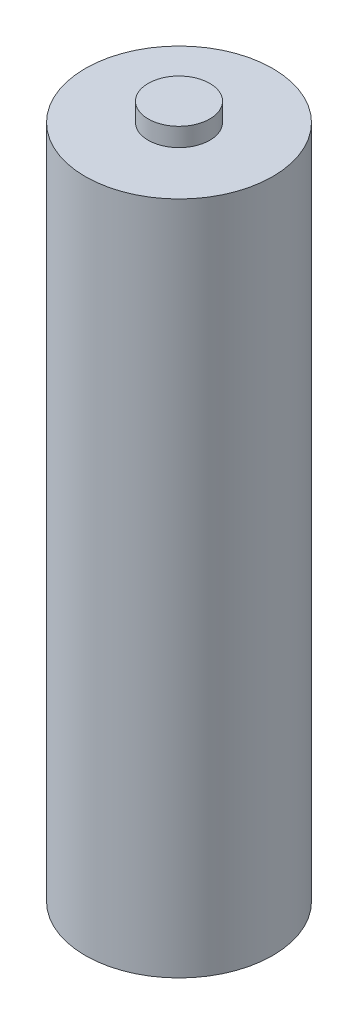
ISO-10303-21;
HEADER;
FILE_DESCRIPTION(('STEP AP214'),'2;1');
FILE_NAME('part.step','',(''),(''),'','','');
FILE_SCHEMA(('AUTOMOTIVE_DESIGN { 1 0 10303 214 1 1 1 1 }'));
ENDSEC;
DATA;
#1=APPLICATION_CONTEXT('core data for automotive mechanical design processes');
#2=APPLICATION_PROTOCOL_DEFINITION('international standard','automotive_design',2000,#1);
#3=PRODUCT_CONTEXT('',#1,'mechanical');
#4=PRODUCT('Part','Part','',(#3));
#5=PRODUCT_RELATED_PRODUCT_CATEGORY('part','',(#4));
#6=PRODUCT_DEFINITION_FORMATION('','',#4);
#7=PRODUCT_DEFINITION_CONTEXT('part definition',#1,'design');
#8=PRODUCT_DEFINITION('design','',#6,#7);
#9=PRODUCT_DEFINITION_SHAPE('','',#8);
#10=(LENGTH_UNIT() NAMED_UNIT(*) SI_UNIT(.MILLI.,.METRE.));
#11=(NAMED_UNIT(*) PLANE_ANGLE_UNIT() SI_UNIT($,.RADIAN.));
#12=(NAMED_UNIT(*) SI_UNIT($,.STERADIAN.) SOLID_ANGLE_UNIT());
#13=UNCERTAINTY_MEASURE_WITH_UNIT(LENGTH_MEASURE(1.E-05),#10,'distance_accuracy_value','');
#14=(GEOMETRIC_REPRESENTATION_CONTEXT(3) GLOBAL_UNCERTAINTY_ASSIGNED_CONTEXT((#13)) GLOBAL_UNIT_ASSIGNED_CONTEXT((#10,
#11,#12)) REPRESENTATION_CONTEXT('',''));
#15=CARTESIAN_POINT('',(0.,0.,0.));
#16=DIRECTION('',(0.,0.,1.));
#17=DIRECTION('',(1.,0.,0.));
#18=AXIS2_PLACEMENT_3D('',#15,#16,#17);
#19=CARTESIAN_POINT('',(0.,65.7,0.));
#20=DIRECTION('',(0.,-1.,0.));
#21=DIRECTION('',(0.,0.,-1.));
#22=AXIS2_PLACEMENT_3D('',#19,#20,#21);
#23=CYLINDRICAL_SURFACE('',#22,9.125);
#24=CARTESIAN_POINT('',(0.,65.7,0.));
#25=DIRECTION('',(0.,1.,0.));
#26=DIRECTION('',(0.,0.,1.));
#27=AXIS2_PLACEMENT_3D('',#24,#25,#26);
#28=CIRCLE('',#27,9.125);
#29=CARTESIAN_POINT('',(0.,65.7,9.125));
#30=VERTEX_POINT('',#29);
#31=EDGE_CURVE('E10',#30,#30,#28,.T.);
#32=ORIENTED_EDGE('',*,*,#31,.F.);
#33=EDGE_LOOP('',(#32));
#34=FACE_BOUND('',#33,.T.);
#35=CARTESIAN_POINT('',(0.,0.,0.));
#36=DIRECTION('',(0.,1.,0.));
#37=DIRECTION('',(0.,0.,1.));
#38=AXIS2_PLACEMENT_3D('',#35,#36,#37);
#39=CIRCLE('',#38,9.125);
#40=CARTESIAN_POINT('',(0.,0.,9.125));
#41=VERTEX_POINT('',#40);
#42=EDGE_CURVE('E36',#41,#41,#39,.T.);
#43=ORIENTED_EDGE('',*,*,#42,.T.);
#44=EDGE_LOOP('',(#43));
#45=FACE_BOUND('',#44,.T.);
#46=ADVANCED_FACE('F33',(#34,#45),#23,.T.);
#47=CARTESIAN_POINT('',(0.,65.7,0.));
#48=DIRECTION('',(0.,1.,0.));
#49=DIRECTION('',(0.,0.,1.));
#50=AXIS2_PLACEMENT_3D('',#47,#48,#49);
#51=PLANE('',#50);
#52=CARTESIAN_POINT('',(0.,65.7,0.));
#53=DIRECTION('',(0.,1.,0.));
#54=DIRECTION('',(0.,0.,1.));
#55=AXIS2_PLACEMENT_3D('',#52,#53,#54);
#56=CIRCLE('',#55,3.);
#57=CARTESIAN_POINT('',(0.,65.7,3.));
#58=VERTEX_POINT('',#57);
#59=EDGE_CURVE('E43',#58,#58,#56,.F.);
#60=ORIENTED_EDGE('',*,*,#59,.T.);
#61=EDGE_LOOP('',(#60));
#62=FACE_BOUND('',#61,.T.);
#63=ORIENTED_EDGE('',*,*,#31,.T.);
#64=EDGE_LOOP('',(#63));
#65=FACE_BOUND('',#64,.T.);
#66=ADVANCED_FACE('F63',(#62,#65),#51,.T.);
#67=CARTESIAN_POINT('',(0.,0.,0.));
#68=DIRECTION('',(0.,1.,0.));
#69=DIRECTION('',(0.,0.,1.));
#70=AXIS2_PLACEMENT_3D('',#67,#68,#69);
#71=PLANE('',#70);
#72=ORIENTED_EDGE('',*,*,#42,.F.);
#73=EDGE_LOOP('',(#72));
#74=FACE_BOUND('',#73,.T.);
#75=ADVANCED_FACE('F55',(#74),#71,.F.);
#76=CARTESIAN_POINT('',(0.,67.5,0.));
#77=DIRECTION('',(0.,-1.,0.));
#78=DIRECTION('',(0.,0.,-1.));
#79=AXIS2_PLACEMENT_3D('',#76,#77,#78);
#80=CYLINDRICAL_SURFACE('',#79,3.);
#81=ORIENTED_EDGE('',*,*,#59,.F.);
#82=EDGE_LOOP('',(#81));
#83=FACE_BOUND('',#82,.T.);
#84=CARTESIAN_POINT('',(0.,67.5,0.));
#85=DIRECTION('',(0.,1.,0.));
#86=DIRECTION('',(0.,0.,1.));
#87=AXIS2_PLACEMENT_3D('',#84,#85,#86);
#88=CIRCLE('',#87,3.);
#89=CARTESIAN_POINT('',(0.,67.5,3.));
#90=VERTEX_POINT('',#89);
#91=EDGE_CURVE('E47',#90,#90,#88,.T.);
#92=ORIENTED_EDGE('',*,*,#91,.F.);
#93=EDGE_LOOP('',(#92));
#94=FACE_BOUND('',#93,.T.);
#95=ADVANCED_FACE('F53',(#83,#94),#80,.T.);
#96=CARTESIAN_POINT('',(0.,67.5,0.));
#97=DIRECTION('',(0.,1.,0.));
#98=DIRECTION('',(0.,0.,1.));
#99=AXIS2_PLACEMENT_3D('',#96,#97,#98);
#100=PLANE('',#99);
#101=ORIENTED_EDGE('',*,*,#91,.T.);
#102=EDGE_LOOP('',(#101));
#103=FACE_BOUND('',#102,.T.);
#104=ADVANCED_FACE('F51',(#103),#100,.T.);
#105=CLOSED_SHELL('',(#46,#66,#75,#95,#104));
#106=MANIFOLD_SOLID_BREP('B2',#105);
#107=ADVANCED_BREP_SHAPE_REPRESENTATION('',(#18,#106),#14);
#108=SHAPE_DEFINITION_REPRESENTATION(#9,#107);
ENDSEC;
END-ISO-10303-21;
